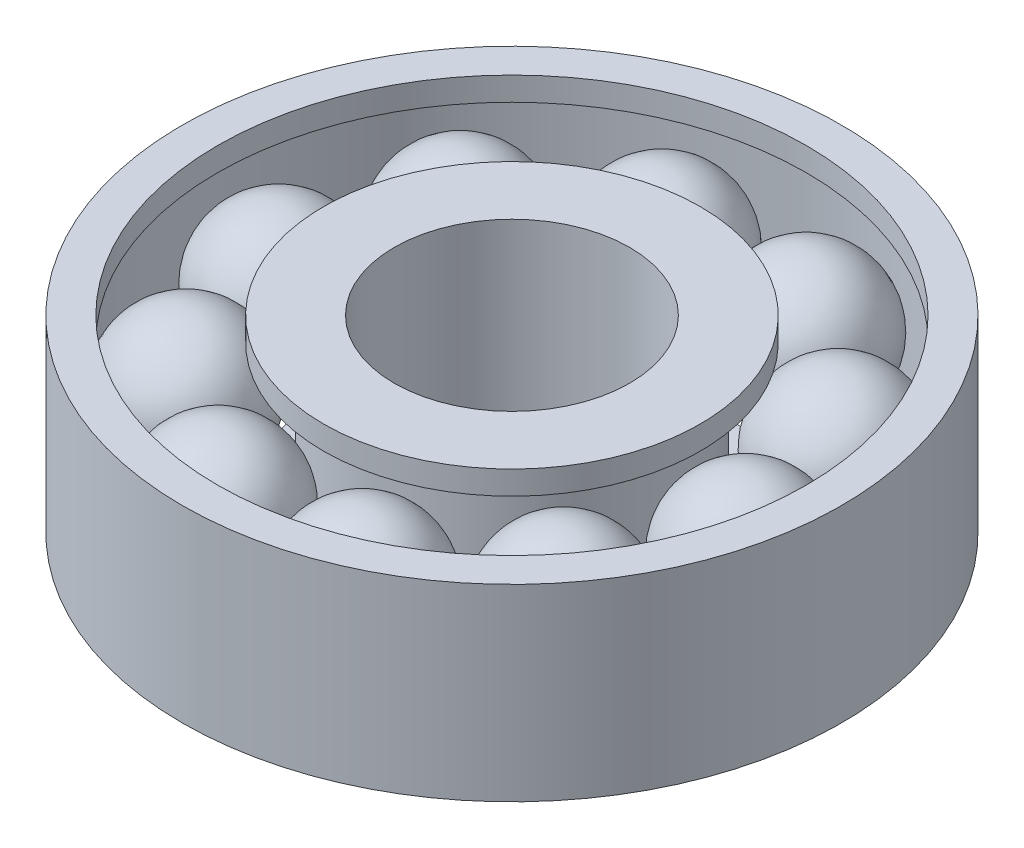
ISO-10303-21;
HEADER;
FILE_DESCRIPTION(('STEP AP214'),'2;1');
FILE_NAME('part.step','',(''),(''),'','','');
FILE_SCHEMA(('AUTOMOTIVE_DESIGN { 1 0 10303 214 1 1 1 1 }'));
ENDSEC;
DATA;
#1=APPLICATION_CONTEXT('core data for automotive mechanical design processes');
#2=APPLICATION_PROTOCOL_DEFINITION('international standard','automotive_design',2000,#1);
#3=PRODUCT_CONTEXT('',#1,'mechanical');
#4=PRODUCT('Part','Part','',(#3));
#5=PRODUCT_RELATED_PRODUCT_CATEGORY('part','',(#4));
#6=PRODUCT_DEFINITION_FORMATION('','',#4);
#7=PRODUCT_DEFINITION_CONTEXT('part definition',#1,'design');
#8=PRODUCT_DEFINITION('design','',#6,#7);
#9=PRODUCT_DEFINITION_SHAPE('','',#8);
#10=(LENGTH_UNIT() NAMED_UNIT(*) SI_UNIT(.MILLI.,.METRE.));
#11=(NAMED_UNIT(*) PLANE_ANGLE_UNIT() SI_UNIT($,.RADIAN.));
#12=(NAMED_UNIT(*) SI_UNIT($,.STERADIAN.) SOLID_ANGLE_UNIT());
#13=UNCERTAINTY_MEASURE_WITH_UNIT(LENGTH_MEASURE(1.E-05),#10,'distance_accuracy_value','');
#14=(GEOMETRIC_REPRESENTATION_CONTEXT(3) GLOBAL_UNCERTAINTY_ASSIGNED_CONTEXT((#13)) GLOBAL_UNIT_ASSIGNED_CONTEXT((#10,
#11,#12)) REPRESENTATION_CONTEXT('',''));
#15=CARTESIAN_POINT('',(0.,0.,0.));
#16=DIRECTION('',(0.,0.,1.));
#17=DIRECTION('',(1.,0.,0.));
#18=AXIS2_PLACEMENT_3D('',#15,#16,#17);
#19=CARTESIAN_POINT('',(8.01957198147729,7.20884205016558,-5.82656010094331));
#20=DIRECTION('',(0.,1.,0.));
#21=DIRECTION('',(0.809016994374955,0.,-0.587785252292462));
#22=AXIS2_PLACEMENT_3D('',#19,#20,#21);
#23=SPHERICAL_SURFACE('',#22,3.);
#24=CARTESIAN_POINT('',(8.01957198147729,10.2088420501656,-5.82656010094331));
#25=VERTEX_POINT('',#24);
#26=VERTEX_LOOP('',#25);
#27=FACE_BOUND('',#26,.T.);
#28=ADVANCED_FACE('F52',(#27),#23,.T.);
#29=CLOSED_SHELL('',(#28));
#30=MANIFOLD_SOLID_BREP('B2',#29);
#31=CARTESIAN_POINT('',(3.06320392169806,7.20884205016558,-9.42757228082043));
#32=DIRECTION('',(0.,1.,0.));
#33=DIRECTION('',(0.309016994374958,0.,-0.95105651629515));
#34=AXIS2_PLACEMENT_3D('',#31,#32,#33);
#35=SPHERICAL_SURFACE('',#34,3.);
#36=CARTESIAN_POINT('',(3.06320392169806,10.2088420501656,-9.42757228082043));
#37=VERTEX_POINT('',#36);
#38=VERTEX_LOOP('',#37);
#39=FACE_BOUND('',#38,.T.);
#40=ADVANCED_FACE('F77',(#39),#35,.T.);
#41=CLOSED_SHELL('',(#40));
#42=MANIFOLD_SOLID_BREP('B6',#41);
#43=CARTESIAN_POINT('',(-3.06320392169786,7.20884205016558,-9.42757228082049));
#44=DIRECTION('',(0.,1.,0.));
#45=DIRECTION('',(-0.309016994374938,0.,-0.951056516295157));
#46=AXIS2_PLACEMENT_3D('',#43,#44,#45);
#47=SPHERICAL_SURFACE('',#46,3.);
#48=CARTESIAN_POINT('',(-3.06320392169786,10.2088420501656,-9.42757228082049));
#49=VERTEX_POINT('',#48);
#50=VERTEX_LOOP('',#49);
#51=FACE_BOUND('',#50,.T.);
#52=ADVANCED_FACE('F102',(#51),#47,.T.);
#53=CLOSED_SHELL('',(#52));
#54=MANIFOLD_SOLID_BREP('B48',#53);
#55=CARTESIAN_POINT('',(-8.01957198147716,7.20884205016558,-5.82656010094349));
#56=DIRECTION('',(0.,1.,0.));
#57=DIRECTION('',(-0.809016994374942,0.,-0.58778525229248));
#58=AXIS2_PLACEMENT_3D('',#55,#56,#57);
#59=SPHERICAL_SURFACE('',#58,3.);
#60=CARTESIAN_POINT('',(-8.01957198147716,10.2088420501656,-5.82656010094349));
#61=VERTEX_POINT('',#60);
#62=VERTEX_LOOP('',#61);
#63=FACE_BOUND('',#62,.T.);
#64=ADVANCED_FACE('F127',(#63),#59,.T.);
#65=CLOSED_SHELL('',(#64));
#66=MANIFOLD_SOLID_BREP('B73',#65);
#67=CARTESIAN_POINT('',(-9.91273611955852,7.20884205016558,0.));
#68=DIRECTION('',(0.,1.,0.));
#69=DIRECTION('',(-1.,0.,0.));
#70=AXIS2_PLACEMENT_3D('',#67,#68,#69);
#71=SPHERICAL_SURFACE('',#70,3.);
#72=CARTESIAN_POINT('',(-9.91273611955852,10.2088420501656,0.));
#73=VERTEX_POINT('',#72);
#74=VERTEX_LOOP('',#73);
#75=FACE_BOUND('',#74,.T.);
#76=ADVANCED_FACE('F152',(#75),#71,.T.);
#77=CLOSED_SHELL('',(#76));
#78=MANIFOLD_SOLID_BREP('B98',#77);
#79=CARTESIAN_POINT('',(-8.01957198147725,7.20884205016558,5.82656010094337));
#80=DIRECTION('',(0.,1.,0.));
#81=DIRECTION('',(-0.809016994374951,0.,0.587785252292469));
#82=AXIS2_PLACEMENT_3D('',#79,#80,#81);
#83=SPHERICAL_SURFACE('',#82,3.);
#84=CARTESIAN_POINT('',(-8.01957198147725,10.2088420501656,5.82656010094337));
#85=VERTEX_POINT('',#84);
#86=VERTEX_LOOP('',#85);
#87=FACE_BOUND('',#86,.T.);
#88=ADVANCED_FACE('F177',(#87),#83,.T.);
#89=CLOSED_SHELL('',(#88));
#90=MANIFOLD_SOLID_BREP('B123',#89);
#91=CARTESIAN_POINT('',(-3.06320392169799,7.20884205016558,9.42757228082045));
#92=DIRECTION('',(0.,1.,0.));
#93=DIRECTION('',(-0.309016994374952,0.,0.951056516295152));
#94=AXIS2_PLACEMENT_3D('',#91,#92,#93);
#95=SPHERICAL_SURFACE('',#94,3.);
#96=CARTESIAN_POINT('',(-3.06320392169799,10.2088420501656,9.42757228082045));
#97=VERTEX_POINT('',#96);
#98=VERTEX_LOOP('',#97);
#99=FACE_BOUND('',#98,.T.);
#100=ADVANCED_FACE('F202',(#99),#95,.T.);
#101=CLOSED_SHELL('',(#100));
#102=MANIFOLD_SOLID_BREP('B148',#101);
#103=CARTESIAN_POINT('',(3.06320392169793,7.20884205016558,9.42757228082047));
#104=DIRECTION('',(0.,1.,0.));
#105=DIRECTION('',(0.309016994374945,0.,0.951056516295155));
#106=AXIS2_PLACEMENT_3D('',#103,#104,#105);
#107=SPHERICAL_SURFACE('',#106,3.);
#108=CARTESIAN_POINT('',(3.06320392169793,10.2088420501656,9.42757228082047));
#109=VERTEX_POINT('',#108);
#110=VERTEX_LOOP('',#109);
#111=FACE_BOUND('',#110,.T.);
#112=ADVANCED_FACE('F227',(#111),#107,.T.);
#113=CLOSED_SHELL('',(#112));
#114=MANIFOLD_SOLID_BREP('B173',#113);
#115=CARTESIAN_POINT('',(8.01957198147721,7.20884205016558,5.82656010094343));
#116=DIRECTION('',(0.,1.,0.));
#117=DIRECTION('',(0.809016994374947,0.,0.587785252292474));
#118=AXIS2_PLACEMENT_3D('',#115,#116,#117);
#119=SPHERICAL_SURFACE('',#118,3.);
#120=CARTESIAN_POINT('',(8.01957198147721,10.2088420501656,5.82656010094343));
#121=VERTEX_POINT('',#120);
#122=VERTEX_LOOP('',#121);
#123=FACE_BOUND('',#122,.T.);
#124=ADVANCED_FACE('F252',(#123),#119,.T.);
#125=CLOSED_SHELL('',(#124));
#126=MANIFOLD_SOLID_BREP('B198',#125);
#127=CARTESIAN_POINT('',(9.91273611955852,7.20884205016558,0.));
#128=DIRECTION('',(0.,1.,0.));
#129=DIRECTION('',(1.,0.,0.));
#130=AXIS2_PLACEMENT_3D('',#127,#128,#129);
#131=SPHERICAL_SURFACE('',#130,3.);
#132=CARTESIAN_POINT('',(9.91273611955852,10.2088420501656,0.));
#133=VERTEX_POINT('',#132);
#134=VERTEX_LOOP('',#133);
#135=FACE_BOUND('',#134,.T.);
#136=ADVANCED_FACE('F279',(#135),#131,.T.);
#137=CLOSED_SHELL('',(#136));
#138=MANIFOLD_SOLID_BREP('B223',#137);
#139=CARTESIAN_POINT('',(0.,11.,0.));
#140=DIRECTION('',(0.,-1.,0.));
#141=DIRECTION('',(0.,0.,-1.));
#142=AXIS2_PLACEMENT_3D('',#139,#140,#141);
#143=CYLINDRICAL_SURFACE('',#142,8.);
#144=CARTESIAN_POINT('',(0.,11.,0.));
#145=DIRECTION('',(0.,1.,0.));
#146=DIRECTION('',(0.,0.,1.));
#147=AXIS2_PLACEMENT_3D('',#144,#145,#146);
#148=CIRCLE('',#147,8.);
#149=CARTESIAN_POINT('',(0.,11.,8.));
#150=VERTEX_POINT('',#149);
#151=EDGE_CURVE('E278',#150,#150,#148,.T.);
#152=ORIENTED_EDGE('',*,*,#151,.F.);
#153=EDGE_LOOP('',(#152));
#154=FACE_BOUND('',#153,.T.);
#155=CARTESIAN_POINT('',(0.,9.99999999999999,0.));
#156=DIRECTION('',(0.,-1.,0.));
#157=DIRECTION('',(0.,0.,-1.));
#158=AXIS2_PLACEMENT_3D('',#155,#156,#157);
#159=CIRCLE('',#158,8.);
#160=CARTESIAN_POINT('',(0.,9.99999999999999,-8.));
#161=VERTEX_POINT('',#160);
#162=EDGE_CURVE('E323',#161,#161,#159,.T.);
#163=ORIENTED_EDGE('',*,*,#162,.F.);
#164=EDGE_LOOP('',(#163));
#165=FACE_BOUND('',#164,.T.);
#166=ADVANCED_FACE('F305',(#154,#165),#143,.T.);
#167=CARTESIAN_POINT('',(0.,11.,0.));
#168=DIRECTION('',(0.,1.,0.));
#169=DIRECTION('',(0.,0.,1.));
#170=AXIS2_PLACEMENT_3D('',#167,#168,#169);
#171=PLANE('',#170);
#172=ORIENTED_EDGE('',*,*,#151,.T.);
#173=EDGE_LOOP('',(#172));
#174=FACE_BOUND('',#173,.T.);
#175=CARTESIAN_POINT('',(0.,11.,0.));
#176=DIRECTION('',(0.,1.,0.));
#177=DIRECTION('',(0.,0.,1.));
#178=AXIS2_PLACEMENT_3D('',#175,#176,#177);
#179=CIRCLE('',#178,5.);
#180=CARTESIAN_POINT('',(0.,11.,5.));
#181=VERTEX_POINT('',#180);
#182=EDGE_CURVE('E318',#181,#181,#179,.T.);
#183=ORIENTED_EDGE('',*,*,#182,.F.);
#184=EDGE_LOOP('',(#183));
#185=FACE_BOUND('',#184,.T.);
#186=ADVANCED_FACE('F359',(#174,#185),#171,.T.);
#187=CARTESIAN_POINT('',(0.,3.,0.));
#188=DIRECTION('',(0.,1.,0.));
#189=DIRECTION('',(0.,0.,1.));
#190=AXIS2_PLACEMENT_3D('',#187,#188,#189);
#191=PLANE('',#190);
#192=CARTESIAN_POINT('',(0.,3.,0.));
#193=DIRECTION('',(0.,1.,0.));
#194=DIRECTION('',(0.,0.,1.));
#195=AXIS2_PLACEMENT_3D('',#192,#193,#194);
#196=CIRCLE('',#195,8.);
#197=CARTESIAN_POINT('',(0.,3.,8.));
#198=VERTEX_POINT('',#197);
#199=EDGE_CURVE('E313',#198,#198,#196,.T.);
#200=ORIENTED_EDGE('',*,*,#199,.F.);
#201=EDGE_LOOP('',(#200));
#202=FACE_BOUND('',#201,.T.);
#203=CARTESIAN_POINT('',(0.,3.,0.));
#204=DIRECTION('',(0.,1.,0.));
#205=DIRECTION('',(0.,0.,1.));
#206=AXIS2_PLACEMENT_3D('',#203,#204,#205);
#207=CIRCLE('',#206,5.);
#208=CARTESIAN_POINT('',(0.,3.,5.));
#209=VERTEX_POINT('',#208);
#210=EDGE_CURVE('E321',#209,#209,#207,.T.);
#211=ORIENTED_EDGE('',*,*,#210,.T.);
#212=EDGE_LOOP('',(#211));
#213=FACE_BOUND('',#212,.T.);
#214=ADVANCED_FACE('F342',(#202,#213),#191,.F.);
#215=CARTESIAN_POINT('',(0.,3.99999999999999,0.));
#216=DIRECTION('',(0.,-1.,0.));
#217=DIRECTION('',(0.,0.,-1.));
#218=AXIS2_PLACEMENT_3D('',#215,#216,#217);
#219=CIRCLE('',#218,8.);
#220=CARTESIAN_POINT('',(0.,3.99999999999999,-8.));
#221=VERTEX_POINT('',#220);
#222=EDGE_CURVE('E309',#221,#221,#219,.T.);
#223=ORIENTED_EDGE('',*,*,#222,.T.);
#224=EDGE_LOOP('',(#223));
#225=FACE_BOUND('',#224,.T.);
#226=ORIENTED_EDGE('',*,*,#199,.T.);
#227=EDGE_LOOP('',(#226));
#228=FACE_BOUND('',#227,.T.);
#229=ADVANCED_FACE('F307',(#225,#228),#143,.T.);
#230=CARTESIAN_POINT('',(0.,11.,0.));
#231=DIRECTION('',(0.,-1.,0.));
#232=DIRECTION('',(0.,0.,-1.));
#233=AXIS2_PLACEMENT_3D('',#230,#231,#232);
#234=CYLINDRICAL_SURFACE('',#233,5.);
#235=ORIENTED_EDGE('',*,*,#182,.T.);
#236=EDGE_LOOP('',(#235));
#237=FACE_BOUND('',#236,.T.);
#238=ORIENTED_EDGE('',*,*,#210,.F.);
#239=EDGE_LOOP('',(#238));
#240=FACE_BOUND('',#239,.T.);
#241=ADVANCED_FACE('F344',(#237,#240),#234,.F.);
#242=CARTESIAN_POINT('',(0.,3.99999999999999,0.));
#243=DIRECTION('',(0.,-1.,0.));
#244=DIRECTION('',(0.,0.,-1.));
#245=AXIS2_PLACEMENT_3D('',#242,#243,#244);
#246=PLANE('',#245);
#247=CARTESIAN_POINT('',(0.,3.99999999999999,0.));
#248=DIRECTION('',(0.,1.,0.));
#249=DIRECTION('',(0.,0.,1.));
#250=AXIS2_PLACEMENT_3D('',#247,#248,#249);
#251=CIRCLE('',#250,6.5);
#252=CARTESIAN_POINT('',(0.,3.99999999999999,6.5));
#253=VERTEX_POINT('',#252);
#254=EDGE_CURVE('E325',#253,#253,#251,.T.);
#255=ORIENTED_EDGE('',*,*,#254,.F.);
#256=EDGE_LOOP('',(#255));
#257=FACE_BOUND('',#256,.T.);
#258=ORIENTED_EDGE('',*,*,#222,.F.);
#259=EDGE_LOOP('',(#258));
#260=FACE_BOUND('',#259,.T.);
#261=ADVANCED_FACE('F346',(#257,#260),#246,.F.);
#262=CARTESIAN_POINT('',(0.,9.99999999999999,0.));
#263=DIRECTION('',(0.,-1.,0.));
#264=DIRECTION('',(0.,0.,-1.));
#265=AXIS2_PLACEMENT_3D('',#262,#263,#264);
#266=PLANE('',#265);
#267=CARTESIAN_POINT('',(0.,9.99999999999999,0.));
#268=DIRECTION('',(0.,1.,0.));
#269=DIRECTION('',(0.,0.,1.));
#270=AXIS2_PLACEMENT_3D('',#267,#268,#269);
#271=CIRCLE('',#270,6.5);
#272=CARTESIAN_POINT('',(0.,9.99999999999999,6.5));
#273=VERTEX_POINT('',#272);
#274=EDGE_CURVE('E330',#273,#273,#271,.T.);
#275=ORIENTED_EDGE('',*,*,#274,.T.);
#276=EDGE_LOOP('',(#275));
#277=FACE_BOUND('',#276,.T.);
#278=ORIENTED_EDGE('',*,*,#162,.T.);
#279=EDGE_LOOP('',(#278));
#280=FACE_BOUND('',#279,.T.);
#281=ADVANCED_FACE('F353',(#277,#280),#266,.T.);
#282=CARTESIAN_POINT('',(0.,11.,0.));
#283=DIRECTION('',(0.,1.,0.));
#284=DIRECTION('',(0.,0.,1.));
#285=AXIS2_PLACEMENT_3D('',#282,#283,#284);
#286=CYLINDRICAL_SURFACE('',#285,6.5);
#287=ORIENTED_EDGE('',*,*,#274,.F.);
#288=EDGE_LOOP('',(#287));
#289=FACE_BOUND('',#288,.T.);
#290=ORIENTED_EDGE('',*,*,#254,.T.);
#291=EDGE_LOOP('',(#290));
#292=FACE_BOUND('',#291,.T.);
#293=ADVANCED_FACE('F406',(#289,#292),#286,.T.);
#294=CLOSED_SHELL('',(#166,#186,#214,#229,#241,#261,#281,#293));
#295=MANIFOLD_SOLID_BREP('B248',#294);
#296=CARTESIAN_POINT('',(0.,11.,0.));
#297=DIRECTION('',(0.,-1.,0.));
#298=DIRECTION('',(0.,0.,-1.));
#299=AXIS2_PLACEMENT_3D('',#296,#297,#298);
#300=CYLINDRICAL_SURFACE('',#299,12.5);
#301=CARTESIAN_POINT('',(0.,11.,0.));
#302=DIRECTION('',(0.,1.,0.));
#303=DIRECTION('',(0.,0.,1.));
#304=AXIS2_PLACEMENT_3D('',#301,#302,#303);
#305=CIRCLE('',#304,12.5);
#306=CARTESIAN_POINT('',(0.,11.,12.5));
#307=VERTEX_POINT('',#306);
#308=EDGE_CURVE('E439',#307,#307,#305,.T.);
#309=ORIENTED_EDGE('',*,*,#308,.T.);
#310=EDGE_LOOP('',(#309));
#311=FACE_BOUND('',#310,.T.);
#312=CARTESIAN_POINT('',(0.,9.99999999999999,0.));
#313=DIRECTION('',(0.,-1.,0.));
#314=DIRECTION('',(0.,0.,-1.));
#315=AXIS2_PLACEMENT_3D('',#312,#313,#314);
#316=CIRCLE('',#315,12.5);
#317=CARTESIAN_POINT('',(0.,9.99999999999999,-12.5));
#318=VERTEX_POINT('',#317);
#319=EDGE_CURVE('E444',#318,#318,#316,.T.);
#320=ORIENTED_EDGE('',*,*,#319,.T.);
#321=EDGE_LOOP('',(#320));
#322=FACE_BOUND('',#321,.T.);
#323=ADVANCED_FACE('F426',(#311,#322),#300,.F.);
#324=CARTESIAN_POINT('',(0.,11.,0.));
#325=DIRECTION('',(0.,1.,0.));
#326=DIRECTION('',(0.,0.,1.));
#327=AXIS2_PLACEMENT_3D('',#324,#325,#326);
#328=PLANE('',#327);
#329=CARTESIAN_POINT('',(0.,11.,0.));
#330=DIRECTION('',(0.,1.,0.));
#331=DIRECTION('',(0.,0.,1.));
#332=AXIS2_PLACEMENT_3D('',#329,#330,#331);
#333=CIRCLE('',#332,14.);
#334=CARTESIAN_POINT('',(0.,11.,14.));
#335=VERTEX_POINT('',#334);
#336=EDGE_CURVE('E304',#335,#335,#333,.T.);
#337=ORIENTED_EDGE('',*,*,#336,.T.);
#338=EDGE_LOOP('',(#337));
#339=FACE_BOUND('',#338,.T.);
#340=ORIENTED_EDGE('',*,*,#308,.F.);
#341=EDGE_LOOP('',(#340));
#342=FACE_BOUND('',#341,.T.);
#343=ADVANCED_FACE('F481',(#339,#342),#328,.T.);
#344=CARTESIAN_POINT('',(0.,3.,0.));
#345=DIRECTION('',(0.,1.,0.));
#346=DIRECTION('',(0.,0.,1.));
#347=AXIS2_PLACEMENT_3D('',#344,#345,#346);
#348=PLANE('',#347);
#349=CARTESIAN_POINT('',(0.,3.,0.));
#350=DIRECTION('',(0.,1.,0.));
#351=DIRECTION('',(0.,0.,1.));
#352=AXIS2_PLACEMENT_3D('',#349,#350,#351);
#353=CIRCLE('',#352,14.);
#354=CARTESIAN_POINT('',(0.,3.,14.));
#355=VERTEX_POINT('',#354);
#356=EDGE_CURVE('E434',#355,#355,#353,.T.);
#357=ORIENTED_EDGE('',*,*,#356,.F.);
#358=EDGE_LOOP('',(#357));
#359=FACE_BOUND('',#358,.T.);
#360=CARTESIAN_POINT('',(0.,3.,0.));
#361=DIRECTION('',(0.,1.,0.));
#362=DIRECTION('',(0.,0.,1.));
#363=AXIS2_PLACEMENT_3D('',#360,#361,#362);
#364=CIRCLE('',#363,12.5);
#365=CARTESIAN_POINT('',(0.,3.,12.5));
#366=VERTEX_POINT('',#365);
#367=EDGE_CURVE('E442',#366,#366,#364,.T.);
#368=ORIENTED_EDGE('',*,*,#367,.T.);
#369=EDGE_LOOP('',(#368));
#370=FACE_BOUND('',#369,.T.);
#371=ADVANCED_FACE('F463',(#359,#370),#348,.F.);
#372=CARTESIAN_POINT('',(0.,11.,0.));
#373=DIRECTION('',(0.,-1.,0.));
#374=DIRECTION('',(0.,0.,-1.));
#375=AXIS2_PLACEMENT_3D('',#372,#373,#374);
#376=CYLINDRICAL_SURFACE('',#375,14.);
#377=ORIENTED_EDGE('',*,*,#336,.F.);
#378=EDGE_LOOP('',(#377));
#379=FACE_BOUND('',#378,.T.);
#380=ORIENTED_EDGE('',*,*,#356,.T.);
#381=EDGE_LOOP('',(#380));
#382=FACE_BOUND('',#381,.T.);
#383=ADVANCED_FACE('F428',(#379,#382),#376,.T.);
#384=CARTESIAN_POINT('',(0.,3.99999999999999,0.));
#385=DIRECTION('',(0.,-1.,0.));
#386=DIRECTION('',(0.,0.,-1.));
#387=AXIS2_PLACEMENT_3D('',#384,#385,#386);
#388=CIRCLE('',#387,12.5);
#389=CARTESIAN_POINT('',(0.,3.99999999999999,-12.5));
#390=VERTEX_POINT('',#389);
#391=EDGE_CURVE('E430',#390,#390,#388,.T.);
#392=ORIENTED_EDGE('',*,*,#391,.F.);
#393=EDGE_LOOP('',(#392));
#394=FACE_BOUND('',#393,.T.);
#395=ORIENTED_EDGE('',*,*,#367,.F.);
#396=EDGE_LOOP('',(#395));
#397=FACE_BOUND('',#396,.T.);
#398=ADVANCED_FACE('F465',(#394,#397),#300,.F.);
#399=CARTESIAN_POINT('',(0.,3.99999999999999,0.));
#400=DIRECTION('',(0.,-1.,0.));
#401=DIRECTION('',(0.,0.,-1.));
#402=AXIS2_PLACEMENT_3D('',#399,#400,#401);
#403=PLANE('',#402);
#404=ORIENTED_EDGE('',*,*,#391,.T.);
#405=EDGE_LOOP('',(#404));
#406=FACE_BOUND('',#405,.T.);
#407=CARTESIAN_POINT('',(0.,3.99999999999999,0.));
#408=DIRECTION('',(0.,1.,0.));
#409=DIRECTION('',(0.,0.,1.));
#410=AXIS2_PLACEMENT_3D('',#407,#408,#409);
#411=CIRCLE('',#410,13.25);
#412=CARTESIAN_POINT('',(0.,3.99999999999999,13.25));
#413=VERTEX_POINT('',#412);
#414=EDGE_CURVE('E451',#413,#413,#411,.T.);
#415=ORIENTED_EDGE('',*,*,#414,.T.);
#416=EDGE_LOOP('',(#415));
#417=FACE_BOUND('',#416,.T.);
#418=ADVANCED_FACE('F467',(#406,#417),#403,.F.);
#419=CARTESIAN_POINT('',(0.,9.99999999999999,0.));
#420=DIRECTION('',(0.,-1.,0.));
#421=DIRECTION('',(0.,0.,-1.));
#422=AXIS2_PLACEMENT_3D('',#419,#420,#421);
#423=PLANE('',#422);
#424=ORIENTED_EDGE('',*,*,#319,.F.);
#425=EDGE_LOOP('',(#424));
#426=FACE_BOUND('',#425,.T.);
#427=CARTESIAN_POINT('',(0.,9.99999999999999,0.));
#428=DIRECTION('',(0.,1.,0.));
#429=DIRECTION('',(0.,0.,1.));
#430=AXIS2_PLACEMENT_3D('',#427,#428,#429);
#431=CIRCLE('',#430,13.25);
#432=CARTESIAN_POINT('',(0.,9.99999999999999,13.25));
#433=VERTEX_POINT('',#432);
#434=EDGE_CURVE('E446',#433,#433,#431,.T.);
#435=ORIENTED_EDGE('',*,*,#434,.F.);
#436=EDGE_LOOP('',(#435));
#437=FACE_BOUND('',#436,.T.);
#438=ADVANCED_FACE('F474',(#426,#437),#423,.T.);
#439=CARTESIAN_POINT('',(0.,11.,0.));
#440=DIRECTION('',(0.,1.,0.));
#441=DIRECTION('',(0.,0.,1.));
#442=AXIS2_PLACEMENT_3D('',#439,#440,#441);
#443=CYLINDRICAL_SURFACE('',#442,13.25);
#444=ORIENTED_EDGE('',*,*,#414,.F.);
#445=EDGE_LOOP('',(#444));
#446=FACE_BOUND('',#445,.T.);
#447=ORIENTED_EDGE('',*,*,#434,.T.);
#448=EDGE_LOOP('',(#447));
#449=FACE_BOUND('',#448,.T.);
#450=ADVANCED_FACE('F523',(#446,#449),#443,.F.);
#451=CLOSED_SHELL('',(#323,#343,#371,#383,#398,#418,#438,#450));
#452=MANIFOLD_SOLID_BREP('B273',#451);
#453=ADVANCED_BREP_SHAPE_REPRESENTATION('',(#18,#30,#42,#54,#66,#78,#90,#102,#114,#126,#138,
#295,#452),#14);
#454=SHAPE_DEFINITION_REPRESENTATION(#9,#453);
ENDSEC;
END-ISO-10303-21;
